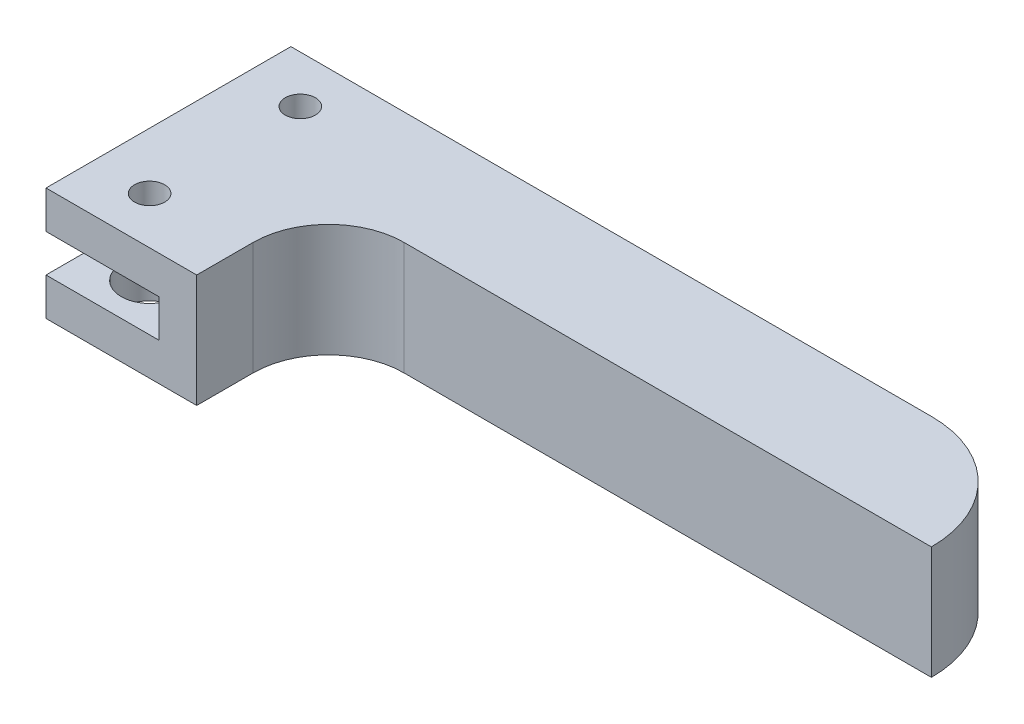
ISO-10303-21;
HEADER;
FILE_DESCRIPTION(('STEP AP214'),'2;1');
FILE_NAME('part.step','',(''),(''),'','','');
FILE_SCHEMA(('AUTOMOTIVE_DESIGN { 1 0 10303 214 1 1 1 1 }'));
ENDSEC;
DATA;
#1=APPLICATION_CONTEXT('core data for automotive mechanical design processes');
#2=APPLICATION_PROTOCOL_DEFINITION('international standard','automotive_design',2000,#1);
#3=PRODUCT_CONTEXT('',#1,'mechanical');
#4=PRODUCT('Part','Part','',(#3));
#5=PRODUCT_RELATED_PRODUCT_CATEGORY('part','',(#4));
#6=PRODUCT_DEFINITION_FORMATION('','',#4);
#7=PRODUCT_DEFINITION_CONTEXT('part definition',#1,'design');
#8=PRODUCT_DEFINITION('design','',#6,#7);
#9=PRODUCT_DEFINITION_SHAPE('','',#8);
#10=(LENGTH_UNIT() NAMED_UNIT(*) SI_UNIT(.MILLI.,.METRE.));
#11=(NAMED_UNIT(*) PLANE_ANGLE_UNIT() SI_UNIT($,.RADIAN.));
#12=(NAMED_UNIT(*) SI_UNIT($,.STERADIAN.) SOLID_ANGLE_UNIT());
#13=UNCERTAINTY_MEASURE_WITH_UNIT(LENGTH_MEASURE(1.E-05),#10,'distance_accuracy_value','');
#14=(GEOMETRIC_REPRESENTATION_CONTEXT(3) GLOBAL_UNCERTAINTY_ASSIGNED_CONTEXT((#13)) GLOBAL_UNIT_ASSIGNED_CONTEXT((#10,
#11,#12)) REPRESENTATION_CONTEXT('',''));
#15=CARTESIAN_POINT('',(0.,0.,0.));
#16=DIRECTION('',(0.,0.,1.));
#17=DIRECTION('',(1.,0.,0.));
#18=AXIS2_PLACEMENT_3D('',#15,#16,#17);
#19=CARTESIAN_POINT('',(-20.,6.,6.5));
#20=DIRECTION('',(1.,0.,0.));
#21=DIRECTION('',(0.,0.,-1.));
#22=AXIS2_PLACEMENT_3D('',#19,#20,#21);
#23=PLANE('',#22);
#24=DIRECTION('',(0.,-1.,0.));
#25=VECTOR('',#24,1.);
#26=CARTESIAN_POINT('',(-20.,6.,-6.5));
#27=LINE('',#26,#25);
#28=CARTESIAN_POINT('',(-20.,6.,-6.5));
#29=VERTEX_POINT('',#28);
#30=CARTESIAN_POINT('',(-20.,4.,-6.5));
#31=VERTEX_POINT('',#30);
#32=EDGE_CURVE('E191',#29,#31,#27,.T.);
#33=ORIENTED_EDGE('',*,*,#32,.T.);
#34=DIRECTION('',(0.,0.,1.));
#35=VECTOR('',#34,1.);
#36=CARTESIAN_POINT('',(-20.,4.,-6.5));
#37=LINE('',#36,#35);
#38=CARTESIAN_POINT('',(-20.,4.,6.5));
#39=VERTEX_POINT('',#38);
#40=EDGE_CURVE('E167',#31,#39,#37,.T.);
#41=ORIENTED_EDGE('',*,*,#40,.T.);
#42=DIRECTION('',(0.,-1.,0.));
#43=VECTOR('',#42,1.);
#44=CARTESIAN_POINT('',(-20.,6.,6.5));
#45=LINE('',#44,#43);
#46=CARTESIAN_POINT('',(-20.,6.,6.5));
#47=VERTEX_POINT('',#46);
#48=EDGE_CURVE('E195',#47,#39,#45,.T.);
#49=ORIENTED_EDGE('',*,*,#48,.F.);
#50=DIRECTION('',(0.,0.,1.));
#51=VECTOR('',#50,1.);
#52=CARTESIAN_POINT('',(-20.,6.,6.5));
#53=LINE('',#52,#51);
#54=EDGE_CURVE('E176',#29,#47,#53,.T.);
#55=ORIENTED_EDGE('',*,*,#54,.F.);
#56=EDGE_LOOP('',(#33,#41,#49,#55));
#57=FACE_BOUND('',#56,.T.);
#58=ADVANCED_FACE('F32',(#57),#23,.F.);
#59=CARTESIAN_POINT('',(-20.,2.,6.5));
#60=VERTEX_POINT('',#59);
#61=CARTESIAN_POINT('',(-20.,0.,6.5));
#62=VERTEX_POINT('',#61);
#63=EDGE_CURVE('E194',#60,#62,#45,.T.);
#64=ORIENTED_EDGE('',*,*,#63,.F.);
#65=DIRECTION('',(0.,0.,1.));
#66=VECTOR('',#65,1.);
#67=CARTESIAN_POINT('',(-20.,2.,-6.5));
#68=LINE('',#67,#66);
#69=CARTESIAN_POINT('',(-20.,2.,-6.5));
#70=VERTEX_POINT('',#69);
#71=EDGE_CURVE('E160',#70,#60,#68,.T.);
#72=ORIENTED_EDGE('',*,*,#71,.F.);
#73=CARTESIAN_POINT('',(-20.,0.,-6.5));
#74=VERTEX_POINT('',#73);
#75=EDGE_CURVE('E184',#70,#74,#27,.T.);
#76=ORIENTED_EDGE('',*,*,#75,.T.);
#77=DIRECTION('',(0.,0.,1.));
#78=VECTOR('',#77,1.);
#79=CARTESIAN_POINT('',(-20.,0.,6.5));
#80=LINE('',#79,#78);
#81=EDGE_CURVE('E170',#74,#62,#80,.T.);
#82=ORIENTED_EDGE('',*,*,#81,.T.);
#83=EDGE_LOOP('',(#64,#72,#76,#82));
#84=FACE_BOUND('',#83,.T.);
#85=ADVANCED_FACE('F267',(#84),#23,.F.);
#86=CARTESIAN_POINT('',(20.,6.,6.5));
#87=DIRECTION('',(0.,0.,-1.));
#88=DIRECTION('',(-1.,0.,0.));
#89=AXIS2_PLACEMENT_3D('',#86,#87,#88);
#90=PLANE('',#89);
#91=DIRECTION('',(1.,0.,0.));
#92=VECTOR('',#91,1.);
#93=CARTESIAN_POINT('',(20.,0.,6.5));
#94=LINE('',#93,#92);
#95=CARTESIAN_POINT('',(-12.,0.,6.5));
#96=VERTEX_POINT('',#95);
#97=EDGE_CURVE('E187',#62,#96,#94,.T.);
#98=ORIENTED_EDGE('',*,*,#97,.T.);
#99=DIRECTION('',(0.,1.,0.));
#100=VECTOR('',#99,1.);
#101=CARTESIAN_POINT('',(-12.,0.,6.5));
#102=LINE('',#101,#100);
#103=CARTESIAN_POINT('',(-12.,6.,6.5));
#104=VERTEX_POINT('',#103);
#105=EDGE_CURVE('E130',#96,#104,#102,.T.);
#106=ORIENTED_EDGE('',*,*,#105,.T.);
#107=DIRECTION('',(1.,0.,0.));
#108=VECTOR('',#107,1.);
#109=CARTESIAN_POINT('',(20.,6.,6.5));
#110=LINE('',#109,#108);
#111=EDGE_CURVE('E179',#47,#104,#110,.T.);
#112=ORIENTED_EDGE('',*,*,#111,.F.);
#113=ORIENTED_EDGE('',*,*,#48,.T.);
#114=DIRECTION('',(-1.,0.,0.));
#115=VECTOR('',#114,1.);
#116=CARTESIAN_POINT('',(-20.,4.,6.5));
#117=LINE('',#116,#115);
#118=CARTESIAN_POINT('',(-14.,4.,6.5));
#119=VERTEX_POINT('',#118);
#120=EDGE_CURVE('E154',#119,#39,#117,.T.);
#121=ORIENTED_EDGE('',*,*,#120,.F.);
#122=DIRECTION('',(0.,1.,0.));
#123=VECTOR('',#122,1.);
#124=CARTESIAN_POINT('',(-14.,4.,6.5));
#125=LINE('',#124,#123);
#126=CARTESIAN_POINT('',(-14.,2.,6.5));
#127=VERTEX_POINT('',#126);
#128=EDGE_CURVE('E163',#127,#119,#125,.T.);
#129=ORIENTED_EDGE('',*,*,#128,.F.);
#130=DIRECTION('',(1.,0.,0.));
#131=VECTOR('',#130,1.);
#132=CARTESIAN_POINT('',(-20.,2.,6.5));
#133=LINE('',#132,#131);
#134=EDGE_CURVE('E147',#60,#127,#133,.T.);
#135=ORIENTED_EDGE('',*,*,#134,.F.);
#136=ORIENTED_EDGE('',*,*,#63,.T.);
#137=EDGE_LOOP('',(#98,#106,#112,#113,#121,#129,#135,#136));
#138=FACE_BOUND('',#137,.T.);
#139=ADVANCED_FACE('F219',(#138),#90,.F.);
#140=CARTESIAN_POINT('',(20.,6.,-6.5));
#141=DIRECTION('',(0.,0.,1.));
#142=DIRECTION('',(1.,0.,0.));
#143=AXIS2_PLACEMENT_3D('',#140,#141,#142);
#144=PLANE('',#143);
#145=DIRECTION('',(-1.,0.,0.));
#146=VECTOR('',#145,1.);
#147=CARTESIAN_POINT('',(20.,6.,-6.5));
#148=LINE('',#147,#146);
#149=CARTESIAN_POINT('',(14.,6.,-6.5));
#150=VERTEX_POINT('',#149);
#151=EDGE_CURVE('E182',#150,#29,#148,.T.);
#152=ORIENTED_EDGE('',*,*,#151,.F.);
#153=DIRECTION('',(0.,-1.,0.));
#154=VECTOR('',#153,1.);
#155=CARTESIAN_POINT('',(14.,6.,-6.5));
#156=LINE('',#155,#154);
#157=CARTESIAN_POINT('',(14.,0.,-6.5));
#158=VERTEX_POINT('',#157);
#159=EDGE_CURVE('E120',#150,#158,#156,.T.);
#160=ORIENTED_EDGE('',*,*,#159,.T.);
#161=DIRECTION('',(-1.,0.,0.));
#162=VECTOR('',#161,1.);
#163=CARTESIAN_POINT('',(20.,0.,-6.5));
#164=LINE('',#163,#162);
#165=EDGE_CURVE('E119',#158,#74,#164,.T.);
#166=ORIENTED_EDGE('',*,*,#165,.T.);
#167=ORIENTED_EDGE('',*,*,#75,.F.);
#168=DIRECTION('',(1.,0.,0.));
#169=VECTOR('',#168,1.);
#170=CARTESIAN_POINT('',(-20.,2.,-6.5));
#171=LINE('',#170,#169);
#172=CARTESIAN_POINT('',(-14.,2.,-6.5));
#173=VERTEX_POINT('',#172);
#174=EDGE_CURVE('E150',#70,#173,#171,.T.);
#175=ORIENTED_EDGE('',*,*,#174,.T.);
#176=DIRECTION('',(0.,1.,0.));
#177=VECTOR('',#176,1.);
#178=CARTESIAN_POINT('',(-14.,4.,-6.5));
#179=LINE('',#178,#177);
#180=CARTESIAN_POINT('',(-14.,4.,-6.5));
#181=VERTEX_POINT('',#180);
#182=EDGE_CURVE('E153',#173,#181,#179,.T.);
#183=ORIENTED_EDGE('',*,*,#182,.T.);
#184=DIRECTION('',(-1.,0.,0.));
#185=VECTOR('',#184,1.);
#186=CARTESIAN_POINT('',(-20.,4.,-6.5));
#187=LINE('',#186,#185);
#188=EDGE_CURVE('E157',#181,#31,#187,.T.);
#189=ORIENTED_EDGE('',*,*,#188,.T.);
#190=ORIENTED_EDGE('',*,*,#32,.F.);
#191=EDGE_LOOP('',(#152,#160,#166,#167,#175,#183,#189,#190));
#192=FACE_BOUND('',#191,.T.);
#193=ADVANCED_FACE('F207',(#192),#144,.F.);
#194=CARTESIAN_POINT('',(0.,6.,0.));
#195=DIRECTION('',(0.,1.,0.));
#196=DIRECTION('',(0.,0.,1.));
#197=AXIS2_PLACEMENT_3D('',#194,#195,#196);
#198=PLANE('',#197);
#199=DIRECTION('',(-1.,0.,0.));
#200=VECTOR('',#199,1.);
#201=CARTESIAN_POINT('',(20.,6.,-0.500000000000003));
#202=LINE('',#201,#200);
#203=CARTESIAN_POINT('',(20.,6.,-0.500000000000003));
#204=VERTEX_POINT('',#203);
#205=CARTESIAN_POINT('',(-8.,6.,-0.5));
#206=VERTEX_POINT('',#205);
#207=EDGE_CURVE('E227',#204,#206,#202,.T.);
#208=ORIENTED_EDGE('',*,*,#207,.F.);
#209=CARTESIAN_POINT('',(14.,6.,-0.500000000000001));
#210=DIRECTION('',(0.,1.,0.));
#211=DIRECTION('',(0.,0.,1.));
#212=AXIS2_PLACEMENT_3D('',#209,#210,#211);
#213=CIRCLE('',#212,6.);
#214=EDGE_CURVE('E11',#204,#150,#213,.T.);
#215=ORIENTED_EDGE('',*,*,#214,.T.);
#216=ORIENTED_EDGE('',*,*,#151,.T.);
#217=ORIENTED_EDGE('',*,*,#54,.T.);
#218=ORIENTED_EDGE('',*,*,#111,.T.);
#219=DIRECTION('',(0.,0.,1.));
#220=VECTOR('',#219,1.);
#221=CARTESIAN_POINT('',(-12.,6.,6.5));
#222=LINE('',#221,#220);
#223=CARTESIAN_POINT('',(-12.,6.,3.5));
#224=VERTEX_POINT('',#223);
#225=EDGE_CURVE('E128',#224,#104,#222,.T.);
#226=ORIENTED_EDGE('',*,*,#225,.F.);
#227=CARTESIAN_POINT('',(-8.,6.,3.5));
#228=DIRECTION('',(0.,1.,0.));
#229=DIRECTION('',(0.,0.,1.));
#230=AXIS2_PLACEMENT_3D('',#227,#228,#229);
#231=CIRCLE('',#230,4.);
#232=EDGE_CURVE('E202',#224,#206,#231,.F.);
#233=ORIENTED_EDGE('',*,*,#232,.T.);
#234=EDGE_LOOP('',(#208,#215,#216,#217,#218,#226,#233));
#235=FACE_BOUND('',#234,.T.);
#236=CARTESIAN_POINT('',(-17.,6.,4.));
#237=DIRECTION('',(0.,1.,0.));
#238=DIRECTION('',(0.,0.,1.));
#239=AXIS2_PLACEMENT_3D('',#236,#237,#238);
#240=CIRCLE('',#239,0.799999999999999);
#241=CARTESIAN_POINT('',(-17.,6.,4.8));
#242=VERTEX_POINT('',#241);
#243=EDGE_CURVE('E133',#242,#242,#240,.T.);
#244=ORIENTED_EDGE('',*,*,#243,.F.);
#245=EDGE_LOOP('',(#244));
#246=FACE_BOUND('',#245,.T.);
#247=CARTESIAN_POINT('',(-17.,6.,-4.));
#248=DIRECTION('',(0.,1.,0.));
#249=DIRECTION('',(0.,0.,1.));
#250=AXIS2_PLACEMENT_3D('',#247,#248,#249);
#251=CIRCLE('',#250,0.799999999999999);
#252=CARTESIAN_POINT('',(-17.,6.,-3.2));
#253=VERTEX_POINT('',#252);
#254=EDGE_CURVE('E141',#253,#253,#251,.T.);
#255=ORIENTED_EDGE('',*,*,#254,.F.);
#256=EDGE_LOOP('',(#255));
#257=FACE_BOUND('',#256,.T.);
#258=ADVANCED_FACE('F212',(#235,#246,#257),#198,.T.);
#259=CARTESIAN_POINT('',(0.,0.,0.));
#260=DIRECTION('',(0.,1.,0.));
#261=DIRECTION('',(0.,0.,1.));
#262=AXIS2_PLACEMENT_3D('',#259,#260,#261);
#263=PLANE('',#262);
#264=CARTESIAN_POINT('',(-17.,0.,4.));
#265=DIRECTION('',(0.,1.,0.));
#266=DIRECTION('',(0.,0.,1.));
#267=AXIS2_PLACEMENT_3D('',#264,#265,#266);
#268=CIRCLE('',#267,1.5);
#269=CARTESIAN_POINT('',(-17.,0.,5.5));
#270=VERTEX_POINT('',#269);
#271=EDGE_CURVE('E234',#270,#270,#268,.T.);
#272=ORIENTED_EDGE('',*,*,#271,.T.);
#273=EDGE_LOOP('',(#272));
#274=FACE_BOUND('',#273,.T.);
#275=CARTESIAN_POINT('',(-17.,0.,-4.));
#276=DIRECTION('',(0.,1.,0.));
#277=DIRECTION('',(0.,0.,1.));
#278=AXIS2_PLACEMENT_3D('',#275,#276,#277);
#279=CIRCLE('',#278,1.5);
#280=CARTESIAN_POINT('',(-17.,0.,-2.5));
#281=VERTEX_POINT('',#280);
#282=EDGE_CURVE('E228',#281,#281,#279,.T.);
#283=ORIENTED_EDGE('',*,*,#282,.T.);
#284=EDGE_LOOP('',(#283));
#285=FACE_BOUND('',#284,.T.);
#286=ORIENTED_EDGE('',*,*,#165,.F.);
#287=CARTESIAN_POINT('',(14.,0.,-0.500000000000001));
#288=DIRECTION('',(0.,1.,0.));
#289=DIRECTION('',(0.,0.,1.));
#290=AXIS2_PLACEMENT_3D('',#287,#288,#289);
#291=CIRCLE('',#290,6.);
#292=CARTESIAN_POINT('',(20.,0.,-0.500000000000003));
#293=VERTEX_POINT('',#292);
#294=EDGE_CURVE('E40',#158,#293,#291,.F.);
#295=ORIENTED_EDGE('',*,*,#294,.T.);
#296=DIRECTION('',(-1.,0.,0.));
#297=VECTOR('',#296,1.);
#298=CARTESIAN_POINT('',(20.,0.,-0.500000000000003));
#299=LINE('',#298,#297);
#300=CARTESIAN_POINT('',(-8.,0.,-0.5));
#301=VERTEX_POINT('',#300);
#302=EDGE_CURVE('E116',#293,#301,#299,.T.);
#303=ORIENTED_EDGE('',*,*,#302,.T.);
#304=CARTESIAN_POINT('',(-8.,0.,3.5));
#305=DIRECTION('',(0.,1.,0.));
#306=DIRECTION('',(0.,0.,1.));
#307=AXIS2_PLACEMENT_3D('',#304,#305,#306);
#308=CIRCLE('',#307,4.);
#309=CARTESIAN_POINT('',(-12.,0.,3.5));
#310=VERTEX_POINT('',#309);
#311=EDGE_CURVE('E204',#301,#310,#308,.T.);
#312=ORIENTED_EDGE('',*,*,#311,.T.);
#313=DIRECTION('',(0.,0.,1.));
#314=VECTOR('',#313,1.);
#315=CARTESIAN_POINT('',(-12.,0.,6.5));
#316=LINE('',#315,#314);
#317=EDGE_CURVE('E127',#310,#96,#316,.T.);
#318=ORIENTED_EDGE('',*,*,#317,.T.);
#319=ORIENTED_EDGE('',*,*,#97,.F.);
#320=ORIENTED_EDGE('',*,*,#81,.F.);
#321=EDGE_LOOP('',(#286,#295,#303,#312,#318,#319,#320));
#322=FACE_BOUND('',#321,.T.);
#323=ADVANCED_FACE('F115',(#274,#285,#322),#263,.F.);
#324=CARTESIAN_POINT('',(-20.,4.,-6.5));
#325=DIRECTION('',(0.,1.,0.));
#326=DIRECTION('',(-1.,0.,0.));
#327=AXIS2_PLACEMENT_3D('',#324,#325,#326);
#328=PLANE('',#327);
#329=CARTESIAN_POINT('',(-17.,4.,4.));
#330=DIRECTION('',(0.,1.,0.));
#331=DIRECTION('',(0.,0.,1.));
#332=AXIS2_PLACEMENT_3D('',#329,#330,#331);
#333=CIRCLE('',#332,0.799999999999999);
#334=CARTESIAN_POINT('',(-17.,4.,4.8));
#335=VERTEX_POINT('',#334);
#336=EDGE_CURVE('E138',#335,#335,#333,.T.);
#337=ORIENTED_EDGE('',*,*,#336,.T.);
#338=EDGE_LOOP('',(#337));
#339=FACE_BOUND('',#338,.T.);
#340=CARTESIAN_POINT('',(-17.,4.,-4.));
#341=DIRECTION('',(0.,1.,0.));
#342=DIRECTION('',(0.,0.,1.));
#343=AXIS2_PLACEMENT_3D('',#340,#341,#342);
#344=CIRCLE('',#343,0.799999999999999);
#345=CARTESIAN_POINT('',(-17.,4.,-3.2));
#346=VERTEX_POINT('',#345);
#347=EDGE_CURVE('E144',#346,#346,#344,.T.);
#348=ORIENTED_EDGE('',*,*,#347,.T.);
#349=EDGE_LOOP('',(#348));
#350=FACE_BOUND('',#349,.T.);
#351=ORIENTED_EDGE('',*,*,#120,.T.);
#352=ORIENTED_EDGE('',*,*,#40,.F.);
#353=ORIENTED_EDGE('',*,*,#188,.F.);
#354=DIRECTION('',(0.,0.,1.));
#355=VECTOR('',#354,1.);
#356=CARTESIAN_POINT('',(-14.,4.,-6.5));
#357=LINE('',#356,#355);
#358=EDGE_CURVE('E171',#181,#119,#357,.T.);
#359=ORIENTED_EDGE('',*,*,#358,.T.);
#360=EDGE_LOOP('',(#351,#352,#353,#359));
#361=FACE_BOUND('',#360,.T.);
#362=ADVANCED_FACE('F288',(#339,#350,#361),#328,.F.);
#363=CARTESIAN_POINT('',(-14.,4.,-6.5));
#364=DIRECTION('',(1.,0.,0.));
#365=DIRECTION('',(0.,0.,-1.));
#366=AXIS2_PLACEMENT_3D('',#363,#364,#365);
#367=PLANE('',#366);
#368=ORIENTED_EDGE('',*,*,#128,.T.);
#369=ORIENTED_EDGE('',*,*,#358,.F.);
#370=ORIENTED_EDGE('',*,*,#182,.F.);
#371=DIRECTION('',(0.,0.,1.));
#372=VECTOR('',#371,1.);
#373=CARTESIAN_POINT('',(-14.,2.,-6.5));
#374=LINE('',#373,#372);
#375=EDGE_CURVE('E173',#173,#127,#374,.T.);
#376=ORIENTED_EDGE('',*,*,#375,.T.);
#377=EDGE_LOOP('',(#368,#369,#370,#376));
#378=FACE_BOUND('',#377,.T.);
#379=ADVANCED_FACE('F256',(#378),#367,.F.);
#380=CARTESIAN_POINT('',(-20.,2.,-6.5));
#381=DIRECTION('',(0.,-1.,0.));
#382=DIRECTION('',(0.,0.,-1.));
#383=AXIS2_PLACEMENT_3D('',#380,#381,#382);
#384=PLANE('',#383);
#385=CARTESIAN_POINT('',(-17.,2.,4.));
#386=DIRECTION('',(0.,1.,0.));
#387=DIRECTION('',(0.,0.,1.));
#388=AXIS2_PLACEMENT_3D('',#385,#386,#387);
#389=CIRCLE('',#388,1.5);
#390=CARTESIAN_POINT('',(-17.,2.,5.5));
#391=VERTEX_POINT('',#390);
#392=EDGE_CURVE('E237',#391,#391,#389,.T.);
#393=ORIENTED_EDGE('',*,*,#392,.F.);
#394=EDGE_LOOP('',(#393));
#395=FACE_BOUND('',#394,.T.);
#396=CARTESIAN_POINT('',(-17.,2.,-4.));
#397=DIRECTION('',(0.,1.,0.));
#398=DIRECTION('',(0.,0.,1.));
#399=AXIS2_PLACEMENT_3D('',#396,#397,#398);
#400=CIRCLE('',#399,1.5);
#401=CARTESIAN_POINT('',(-17.,2.,-2.5));
#402=VERTEX_POINT('',#401);
#403=EDGE_CURVE('E231',#402,#402,#400,.T.);
#404=ORIENTED_EDGE('',*,*,#403,.F.);
#405=EDGE_LOOP('',(#404));
#406=FACE_BOUND('',#405,.T.);
#407=ORIENTED_EDGE('',*,*,#134,.T.);
#408=ORIENTED_EDGE('',*,*,#375,.F.);
#409=ORIENTED_EDGE('',*,*,#174,.F.);
#410=ORIENTED_EDGE('',*,*,#71,.T.);
#411=EDGE_LOOP('',(#407,#408,#409,#410));
#412=FACE_BOUND('',#411,.T.);
#413=ADVANCED_FACE('F252',(#395,#406,#412),#384,.F.);
#414=CARTESIAN_POINT('',(-17.,4.,-4.));
#415=DIRECTION('',(0.,1.,0.));
#416=DIRECTION('',(0.,0.,1.));
#417=AXIS2_PLACEMENT_3D('',#414,#415,#416);
#418=CYLINDRICAL_SURFACE('',#417,0.799999999999999);
#419=ORIENTED_EDGE('',*,*,#347,.F.);
#420=EDGE_LOOP('',(#419));
#421=FACE_BOUND('',#420,.T.);
#422=ORIENTED_EDGE('',*,*,#254,.T.);
#423=EDGE_LOOP('',(#422));
#424=FACE_BOUND('',#423,.T.);
#425=ADVANCED_FACE('F255',(#421,#424),#418,.F.);
#426=CARTESIAN_POINT('',(-17.,4.,4.));
#427=DIRECTION('',(0.,1.,0.));
#428=DIRECTION('',(0.,0.,1.));
#429=AXIS2_PLACEMENT_3D('',#426,#427,#428);
#430=CYLINDRICAL_SURFACE('',#429,0.799999999999999);
#431=ORIENTED_EDGE('',*,*,#336,.F.);
#432=EDGE_LOOP('',(#431));
#433=FACE_BOUND('',#432,.T.);
#434=ORIENTED_EDGE('',*,*,#243,.T.);
#435=EDGE_LOOP('',(#434));
#436=FACE_BOUND('',#435,.T.);
#437=ADVANCED_FACE('F298',(#433,#436),#430,.F.);
#438=CARTESIAN_POINT('',(-12.,0.,6.5));
#439=DIRECTION('',(-1.,0.,0.));
#440=DIRECTION('',(0.,0.,1.));
#441=AXIS2_PLACEMENT_3D('',#438,#439,#440);
#442=PLANE('',#441);
#443=ORIENTED_EDGE('',*,*,#317,.F.);
#444=DIRECTION('',(0.,1.,0.));
#445=VECTOR('',#444,1.);
#446=CARTESIAN_POINT('',(-12.,6.,3.5));
#447=LINE('',#446,#445);
#448=EDGE_CURVE('E198',#310,#224,#447,.T.);
#449=ORIENTED_EDGE('',*,*,#448,.T.);
#450=ORIENTED_EDGE('',*,*,#225,.T.);
#451=ORIENTED_EDGE('',*,*,#105,.F.);
#452=EDGE_LOOP('',(#443,#449,#450,#451));
#453=FACE_BOUND('',#452,.T.);
#454=ADVANCED_FACE('F225',(#453),#442,.F.);
#455=CARTESIAN_POINT('',(20.,0.,-0.500000000000003));
#456=DIRECTION('',(0.,0.,-1.));
#457=DIRECTION('',(-1.,0.,0.));
#458=AXIS2_PLACEMENT_3D('',#455,#456,#457);
#459=PLANE('',#458);
#460=ORIENTED_EDGE('',*,*,#207,.T.);
#461=DIRECTION('',(0.,1.,0.));
#462=VECTOR('',#461,1.);
#463=CARTESIAN_POINT('',(-8.,0.,-0.5));
#464=LINE('',#463,#462);
#465=EDGE_CURVE('E126',#206,#301,#464,.F.);
#466=ORIENTED_EDGE('',*,*,#465,.T.);
#467=ORIENTED_EDGE('',*,*,#302,.F.);
#468=DIRECTION('',(0.,1.,0.));
#469=VECTOR('',#468,1.);
#470=CARTESIAN_POINT('',(20.,0.,-0.500000000000003));
#471=LINE('',#470,#469);
#472=EDGE_CURVE('E124',#293,#204,#471,.T.);
#473=ORIENTED_EDGE('',*,*,#472,.T.);
#474=EDGE_LOOP('',(#460,#466,#467,#473));
#475=FACE_BOUND('',#474,.T.);
#476=ADVANCED_FACE('F123',(#475),#459,.F.);
#477=CARTESIAN_POINT('',(-8.,0.,3.5));
#478=DIRECTION('',(0.,-1.,0.));
#479=DIRECTION('',(0.,0.,-1.));
#480=AXIS2_PLACEMENT_3D('',#477,#478,#479);
#481=CYLINDRICAL_SURFACE('',#480,4.);
#482=ORIENTED_EDGE('',*,*,#311,.F.);
#483=ORIENTED_EDGE('',*,*,#465,.F.);
#484=ORIENTED_EDGE('',*,*,#232,.F.);
#485=ORIENTED_EDGE('',*,*,#448,.F.);
#486=EDGE_LOOP('',(#482,#483,#484,#485));
#487=FACE_BOUND('',#486,.T.);
#488=ADVANCED_FACE('F269',(#487),#481,.F.);
#489=CARTESIAN_POINT('',(14.,6.,-0.500000000000001));
#490=DIRECTION('',(0.,-1.,0.));
#491=DIRECTION('',(0.,0.,-1.));
#492=AXIS2_PLACEMENT_3D('',#489,#490,#491);
#493=CYLINDRICAL_SURFACE('',#492,6.);
#494=ORIENTED_EDGE('',*,*,#214,.F.);
#495=ORIENTED_EDGE('',*,*,#472,.F.);
#496=ORIENTED_EDGE('',*,*,#294,.F.);
#497=ORIENTED_EDGE('',*,*,#159,.F.);
#498=EDGE_LOOP('',(#494,#495,#496,#497));
#499=FACE_BOUND('',#498,.T.);
#500=ADVANCED_FACE('F34',(#499),#493,.T.);
#501=CARTESIAN_POINT('',(-17.,0.,-4.));
#502=DIRECTION('',(0.,1.,0.));
#503=DIRECTION('',(0.,0.,1.));
#504=AXIS2_PLACEMENT_3D('',#501,#502,#503);
#505=CYLINDRICAL_SURFACE('',#504,1.5);
#506=ORIENTED_EDGE('',*,*,#282,.F.);
#507=EDGE_LOOP('',(#506));
#508=FACE_BOUND('',#507,.T.);
#509=ORIENTED_EDGE('',*,*,#403,.T.);
#510=EDGE_LOOP('',(#509));
#511=FACE_BOUND('',#510,.T.);
#512=ADVANCED_FACE('F248',(#508,#511),#505,.F.);
#513=CARTESIAN_POINT('',(-17.,0.,4.));
#514=DIRECTION('',(0.,1.,0.));
#515=DIRECTION('',(0.,0.,1.));
#516=AXIS2_PLACEMENT_3D('',#513,#514,#515);
#517=CYLINDRICAL_SURFACE('',#516,1.5);
#518=ORIENTED_EDGE('',*,*,#271,.F.);
#519=EDGE_LOOP('',(#518));
#520=FACE_BOUND('',#519,.T.);
#521=ORIENTED_EDGE('',*,*,#392,.T.);
#522=EDGE_LOOP('',(#521));
#523=FACE_BOUND('',#522,.T.);
#524=ADVANCED_FACE('F245',(#520,#523),#517,.F.);
#525=CLOSED_SHELL('',(#58,#85,#139,#193,#258,#323,#362,#379,#413,#425,#437,#454,#476,#488,#500,
#512,#524));
#526=MANIFOLD_SOLID_BREP('B2',#525);
#527=ADVANCED_BREP_SHAPE_REPRESENTATION('',(#18,#526),#14);
#528=SHAPE_DEFINITION_REPRESENTATION(#9,#527);
ENDSEC;
END-ISO-10303-21;
